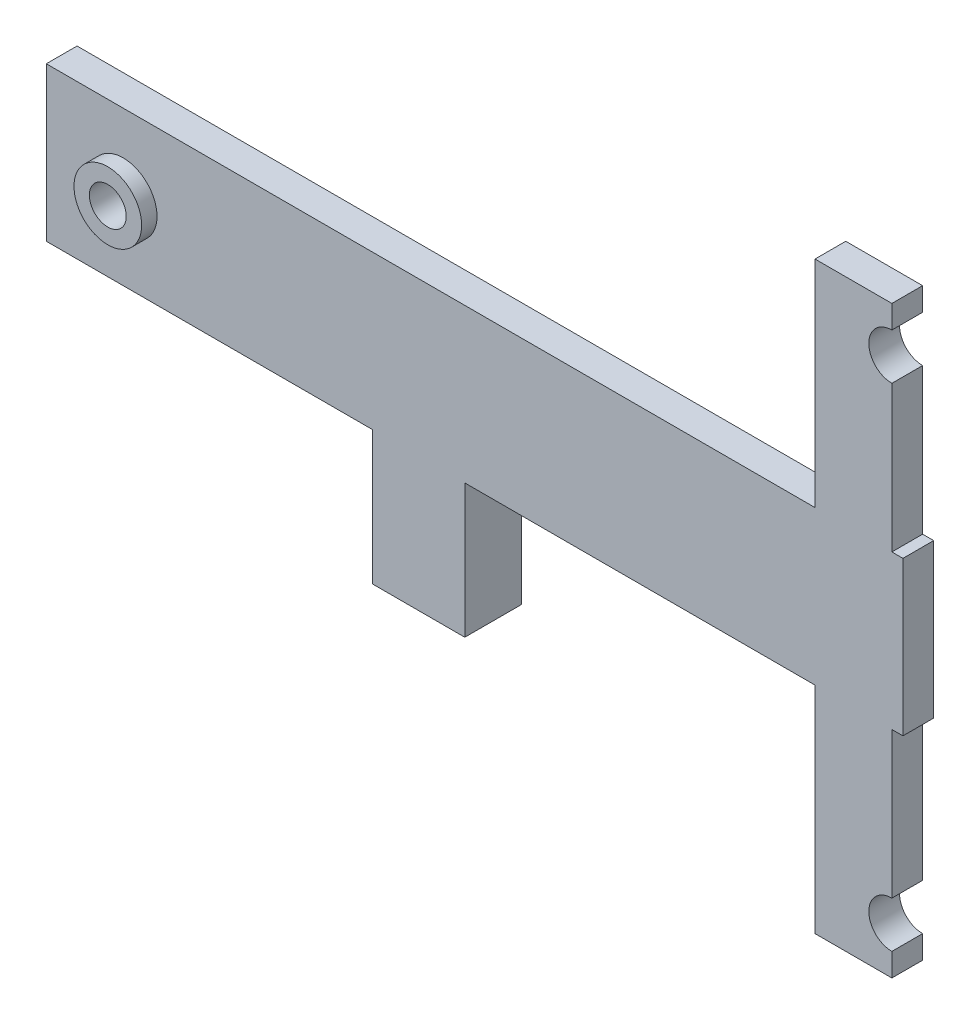
ISO-10303-21;
HEADER;
FILE_DESCRIPTION(('STEP AP214'),'2;1');
FILE_NAME('part.step','',(''),(''),'','','');
FILE_SCHEMA(('AUTOMOTIVE_DESIGN { 1 0 10303 214 1 1 1 1 }'));
ENDSEC;
DATA;
#1=APPLICATION_CONTEXT('core data for automotive mechanical design processes');
#2=APPLICATION_PROTOCOL_DEFINITION('international standard','automotive_design',2000,#1);
#3=PRODUCT_CONTEXT('',#1,'mechanical');
#4=PRODUCT('Part','Part','',(#3));
#5=PRODUCT_RELATED_PRODUCT_CATEGORY('part','',(#4));
#6=PRODUCT_DEFINITION_FORMATION('','',#4);
#7=PRODUCT_DEFINITION_CONTEXT('part definition',#1,'design');
#8=PRODUCT_DEFINITION('design','',#6,#7);
#9=PRODUCT_DEFINITION_SHAPE('','',#8);
#10=(LENGTH_UNIT() NAMED_UNIT(*) SI_UNIT(.MILLI.,.METRE.));
#11=(NAMED_UNIT(*) PLANE_ANGLE_UNIT() SI_UNIT($,.RADIAN.));
#12=(NAMED_UNIT(*) SI_UNIT($,.STERADIAN.) SOLID_ANGLE_UNIT());
#13=UNCERTAINTY_MEASURE_WITH_UNIT(LENGTH_MEASURE(1.E-05),#10,'distance_accuracy_value','');
#14=(GEOMETRIC_REPRESENTATION_CONTEXT(3) GLOBAL_UNCERTAINTY_ASSIGNED_CONTEXT((#13)) GLOBAL_UNIT_ASSIGNED_CONTEXT((#10,
#11,#12)) REPRESENTATION_CONTEXT('',''));
#15=CARTESIAN_POINT('',(0.,0.,0.));
#16=DIRECTION('',(0.,0.,1.));
#17=DIRECTION('',(1.,0.,0.));
#18=AXIS2_PLACEMENT_3D('',#15,#16,#17);
#19=CARTESIAN_POINT('',(0.,0.,-1.));
#20=DIRECTION('',(0.,0.,1.));
#21=DIRECTION('',(1.,0.,0.));
#22=AXIS2_PLACEMENT_3D('',#19,#20,#21);
#23=PLANE('',#22);
#24=CARTESIAN_POINT('',(0.,0.,-1.));
#25=DIRECTION('',(0.,0.,1.));
#26=DIRECTION('',(1.,0.,0.));
#27=AXIS2_PLACEMENT_3D('',#24,#25,#26);
#28=CIRCLE('',#27,2.2);
#29=CARTESIAN_POINT('',(2.2,0.,-1.));
#30=VERTEX_POINT('',#29);
#31=EDGE_CURVE('E357',#30,#30,#28,.F.);
#32=ORIENTED_EDGE('',*,*,#31,.F.);
#33=EDGE_LOOP('',(#32));
#34=FACE_BOUND('',#33,.T.);
#35=DIRECTION('',(0.,1.,0.));
#36=VECTOR('',#35,1.);
#37=CARTESIAN_POINT('',(16.22,0.,-1.));
#38=LINE('',#37,#36);
#39=CARTESIAN_POINT('',(16.22,-5.,-1.));
#40=VERTEX_POINT('',#39);
#41=CARTESIAN_POINT('',(16.22,-1.696,-1.));
#42=VERTEX_POINT('',#41);
#43=EDGE_CURVE('E226',#40,#42,#38,.T.);
#44=ORIENTED_EDGE('',*,*,#43,.F.);
#45=DIRECTION('',(-1.,0.,0.));
#46=VECTOR('',#45,1.);
#47=CARTESIAN_POINT('',(0.,-5.,-1.));
#48=LINE('',#47,#46);
#49=CARTESIAN_POINT('',(-4.99999999999999,-5.,-1.));
#50=VERTEX_POINT('',#49);
#51=EDGE_CURVE('E286',#40,#50,#48,.T.);
#52=ORIENTED_EDGE('',*,*,#51,.T.);
#53=DIRECTION('',(0.,1.,0.));
#54=VECTOR('',#53,1.);
#55=CARTESIAN_POINT('',(-4.99999999999999,0.,-1.));
#56=LINE('',#55,#54);
#57=CARTESIAN_POINT('',(-4.99999999999999,5.,-1.));
#58=VERTEX_POINT('',#57);
#59=EDGE_CURVE('E307',#50,#58,#56,.T.);
#60=ORIENTED_EDGE('',*,*,#59,.T.);
#61=DIRECTION('',(1.,0.,0.));
#62=VECTOR('',#61,1.);
#63=CARTESIAN_POINT('',(0.,5.,-1.));
#64=LINE('',#63,#62);
#65=CARTESIAN_POINT('',(45.,5.00000000000001,-1.));
#66=VERTEX_POINT('',#65);
#67=EDGE_CURVE('E294',#58,#66,#64,.T.);
#68=ORIENTED_EDGE('',*,*,#67,.T.);
#69=DIRECTION('',(0.,1.,0.));
#70=VECTOR('',#69,1.);
#71=CARTESIAN_POINT('',(45.,0.,-1.));
#72=LINE('',#71,#70);
#73=CARTESIAN_POINT('',(45.,19.,-1.));
#74=VERTEX_POINT('',#73);
#75=EDGE_CURVE('E304',#66,#74,#72,.T.);
#76=ORIENTED_EDGE('',*,*,#75,.T.);
#77=DIRECTION('',(1.,0.,0.));
#78=VECTOR('',#77,1.);
#79=CARTESIAN_POINT('',(0.,19.,-1.));
#80=LINE('',#79,#78);
#81=CARTESIAN_POINT('',(50.,19.,-1.));
#82=VERTEX_POINT('',#81);
#83=EDGE_CURVE('E301',#74,#82,#80,.T.);
#84=ORIENTED_EDGE('',*,*,#83,.T.);
#85=DIRECTION('',(0.,-1.,0.));
#86=VECTOR('',#85,1.);
#87=CARTESIAN_POINT('',(50.,0.,-1.));
#88=LINE('',#87,#86);
#89=CARTESIAN_POINT('',(50.,17.5,-1.));
#90=VERTEX_POINT('',#89);
#91=EDGE_CURVE('E298',#82,#90,#88,.T.);
#92=ORIENTED_EDGE('',*,*,#91,.T.);
#93=CARTESIAN_POINT('',(50.,16.,-1.));
#94=DIRECTION('',(0.,0.,1.));
#95=DIRECTION('',(1.,0.,0.));
#96=AXIS2_PLACEMENT_3D('',#93,#94,#95);
#97=CIRCLE('',#96,1.5);
#98=CARTESIAN_POINT('',(50.,14.5,-1.));
#99=VERTEX_POINT('',#98);
#100=EDGE_CURVE('E297',#99,#90,#97,.F.);
#101=ORIENTED_EDGE('',*,*,#100,.F.);
#102=CARTESIAN_POINT('',(50.,5.00000000000001,-1.));
#103=VERTEX_POINT('',#102);
#104=EDGE_CURVE('E293',#99,#103,#88,.T.);
#105=ORIENTED_EDGE('',*,*,#104,.T.);
#106=CARTESIAN_POINT('',(50.72,5.00000000000001,-1.));
#107=VERTEX_POINT('',#106);
#108=EDGE_CURVE('E290',#103,#107,#64,.T.);
#109=ORIENTED_EDGE('',*,*,#108,.T.);
#110=DIRECTION('',(0.,1.,0.));
#111=VECTOR('',#110,1.);
#112=CARTESIAN_POINT('',(50.72,0.,-1.));
#113=LINE('',#112,#111);
#114=CARTESIAN_POINT('',(50.72,-4.99999999999999,-1.));
#115=VERTEX_POINT('',#114);
#116=EDGE_CURVE('E285',#115,#107,#113,.T.);
#117=ORIENTED_EDGE('',*,*,#116,.F.);
#118=CARTESIAN_POINT('',(50.,-4.99999999999999,-1.));
#119=VERTEX_POINT('',#118);
#120=EDGE_CURVE('E243',#115,#119,#48,.T.);
#121=ORIENTED_EDGE('',*,*,#120,.T.);
#122=DIRECTION('',(0.,1.,0.));
#123=VECTOR('',#122,1.);
#124=CARTESIAN_POINT('',(50.,0.,-1.));
#125=LINE('',#124,#123);
#126=CARTESIAN_POINT('',(50.,-14.5,-1.));
#127=VERTEX_POINT('',#126);
#128=EDGE_CURVE('E248',#127,#119,#125,.T.);
#129=ORIENTED_EDGE('',*,*,#128,.F.);
#130=CARTESIAN_POINT('',(50.,-16.,-1.));
#131=DIRECTION('',(0.,0.,1.));
#132=DIRECTION('',(1.,0.,0.));
#133=AXIS2_PLACEMENT_3D('',#130,#131,#132);
#134=CIRCLE('',#133,1.5);
#135=CARTESIAN_POINT('',(50.,-17.5,-1.));
#136=VERTEX_POINT('',#135);
#137=EDGE_CURVE('E319',#127,#136,#134,.T.);
#138=ORIENTED_EDGE('',*,*,#137,.T.);
#139=CARTESIAN_POINT('',(50.,-19.,-1.));
#140=VERTEX_POINT('',#139);
#141=EDGE_CURVE('E316',#140,#136,#125,.T.);
#142=ORIENTED_EDGE('',*,*,#141,.F.);
#143=DIRECTION('',(1.,0.,0.));
#144=VECTOR('',#143,1.);
#145=CARTESIAN_POINT('',(0.,-19.,-1.));
#146=LINE('',#145,#144);
#147=CARTESIAN_POINT('',(45.,-19.,-1.));
#148=VERTEX_POINT('',#147);
#149=EDGE_CURVE('E313',#148,#140,#146,.T.);
#150=ORIENTED_EDGE('',*,*,#149,.F.);
#151=DIRECTION('',(0.,-1.,0.));
#152=VECTOR('',#151,1.);
#153=CARTESIAN_POINT('',(45.,0.,-1.));
#154=LINE('',#153,#152);
#155=CARTESIAN_POINT('',(45.,-4.99999999999999,-1.));
#156=VERTEX_POINT('',#155);
#157=EDGE_CURVE('E310',#156,#148,#154,.T.);
#158=ORIENTED_EDGE('',*,*,#157,.F.);
#159=CARTESIAN_POINT('',(22.22,-5.,-1.));
#160=VERTEX_POINT('',#159);
#161=EDGE_CURVE('E287',#156,#160,#48,.T.);
#162=ORIENTED_EDGE('',*,*,#161,.T.);
#163=DIRECTION('',(0.,1.,0.));
#164=VECTOR('',#163,1.);
#165=CARTESIAN_POINT('',(22.22,0.,-1.));
#166=LINE('',#165,#164);
#167=CARTESIAN_POINT('',(22.22,-1.696,-1.));
#168=VERTEX_POINT('',#167);
#169=EDGE_CURVE('E53',#160,#168,#166,.T.);
#170=ORIENTED_EDGE('',*,*,#169,.T.);
#171=DIRECTION('',(1.,0.,0.));
#172=VECTOR('',#171,1.);
#173=CARTESIAN_POINT('',(0.,-1.696,-1.));
#174=LINE('',#173,#172);
#175=EDGE_CURVE('E11',#42,#168,#174,.T.);
#176=ORIENTED_EDGE('',*,*,#175,.F.);
#177=EDGE_LOOP('',(#44,#52,#60,#68,#76,#84,#92,#101,#105,#109,#117,#121,#129,#138,#142,#150,
#158,#162,#170,#176));
#178=FACE_BOUND('',#177,.T.);
#179=ADVANCED_FACE('F35',(#34,#178),#23,.F.);
#180=CARTESIAN_POINT('',(0.,-5.,1.));
#181=DIRECTION('',(0.,-1.,0.));
#182=DIRECTION('',(1.,0.,0.));
#183=AXIS2_PLACEMENT_3D('',#180,#181,#182);
#184=PLANE('',#183);
#185=ORIENTED_EDGE('',*,*,#51,.F.);
#186=DIRECTION('',(0.,0.,1.));
#187=VECTOR('',#186,1.);
#188=CARTESIAN_POINT('',(16.22,-5.,1.));
#189=LINE('',#188,#187);
#190=CARTESIAN_POINT('',(16.22,-5.,1.));
#191=VERTEX_POINT('',#190);
#192=EDGE_CURVE('E43',#40,#191,#189,.T.);
#193=ORIENTED_EDGE('',*,*,#192,.T.);
#194=DIRECTION('',(-1.,0.,0.));
#195=VECTOR('',#194,1.);
#196=CARTESIAN_POINT('',(0.,-5.,1.));
#197=LINE('',#196,#195);
#198=CARTESIAN_POINT('',(-4.99999999999999,-5.,1.));
#199=VERTEX_POINT('',#198);
#200=EDGE_CURVE('E249',#191,#199,#197,.T.);
#201=ORIENTED_EDGE('',*,*,#200,.T.);
#202=DIRECTION('',(0.,0.,-1.));
#203=VECTOR('',#202,1.);
#204=CARTESIAN_POINT('',(-4.99999999999999,-5.,1.));
#205=LINE('',#204,#203);
#206=EDGE_CURVE('E336',#199,#50,#205,.T.);
#207=ORIENTED_EDGE('',*,*,#206,.T.);
#208=EDGE_LOOP('',(#185,#193,#201,#207));
#209=FACE_BOUND('',#208,.T.);
#210=ADVANCED_FACE('F366',(#209),#184,.T.);
#211=CARTESIAN_POINT('',(0.,0.,1.));
#212=DIRECTION('',(0.,0.,1.));
#213=DIRECTION('',(1.,0.,0.));
#214=AXIS2_PLACEMENT_3D('',#211,#212,#213);
#215=PLANE('',#214);
#216=ORIENTED_EDGE('',*,*,#200,.F.);
#217=DIRECTION('',(0.,1.,0.));
#218=VECTOR('',#217,1.);
#219=CARTESIAN_POINT('',(16.22,-13.696,1.));
#220=LINE('',#219,#218);
#221=CARTESIAN_POINT('',(16.22,-13.696,1.));
#222=VERTEX_POINT('',#221);
#223=EDGE_CURVE('E189',#222,#191,#220,.T.);
#224=ORIENTED_EDGE('',*,*,#223,.F.);
#225=DIRECTION('',(-1.,0.,0.));
#226=VECTOR('',#225,1.);
#227=CARTESIAN_POINT('',(22.22,-13.696,1.));
#228=LINE('',#227,#226);
#229=CARTESIAN_POINT('',(22.22,-13.696,1.));
#230=VERTEX_POINT('',#229);
#231=EDGE_CURVE('E215',#230,#222,#228,.T.);
#232=ORIENTED_EDGE('',*,*,#231,.F.);
#233=DIRECTION('',(0.,-1.,0.));
#234=VECTOR('',#233,1.);
#235=CARTESIAN_POINT('',(22.22,-1.696,1.));
#236=LINE('',#235,#234);
#237=CARTESIAN_POINT('',(22.22,-5.,1.));
#238=VERTEX_POINT('',#237);
#239=EDGE_CURVE('E213',#238,#230,#236,.T.);
#240=ORIENTED_EDGE('',*,*,#239,.F.);
#241=CARTESIAN_POINT('',(45.,-4.99999999999999,1.));
#242=VERTEX_POINT('',#241);
#243=EDGE_CURVE('E250',#242,#238,#197,.T.);
#244=ORIENTED_EDGE('',*,*,#243,.F.);
#245=DIRECTION('',(0.,-1.,0.));
#246=VECTOR('',#245,1.);
#247=CARTESIAN_POINT('',(45.,0.,1.));
#248=LINE('',#247,#246);
#249=CARTESIAN_POINT('',(45.,-19.,1.));
#250=VERTEX_POINT('',#249);
#251=EDGE_CURVE('E271',#242,#250,#248,.T.);
#252=ORIENTED_EDGE('',*,*,#251,.T.);
#253=DIRECTION('',(1.,0.,0.));
#254=VECTOR('',#253,1.);
#255=CARTESIAN_POINT('',(0.,-19.,1.));
#256=LINE('',#255,#254);
#257=CARTESIAN_POINT('',(50.,-19.,1.));
#258=VERTEX_POINT('',#257);
#259=EDGE_CURVE('E274',#250,#258,#256,.T.);
#260=ORIENTED_EDGE('',*,*,#259,.T.);
#261=DIRECTION('',(0.,1.,0.));
#262=VECTOR('',#261,1.);
#263=CARTESIAN_POINT('',(50.,0.,1.));
#264=LINE('',#263,#262);
#265=CARTESIAN_POINT('',(50.,-17.5,1.));
#266=VERTEX_POINT('',#265);
#267=EDGE_CURVE('E277',#258,#266,#264,.T.);
#268=ORIENTED_EDGE('',*,*,#267,.T.);
#269=CARTESIAN_POINT('',(50.,-16.,1.));
#270=DIRECTION('',(0.,0.,1.));
#271=DIRECTION('',(1.,0.,0.));
#272=AXIS2_PLACEMENT_3D('',#269,#270,#271);
#273=CIRCLE('',#272,1.5);
#274=CARTESIAN_POINT('',(50.,-14.5,1.));
#275=VERTEX_POINT('',#274);
#276=EDGE_CURVE('E279',#275,#266,#273,.T.);
#277=ORIENTED_EDGE('',*,*,#276,.F.);
#278=CARTESIAN_POINT('',(50.,-4.99999999999999,1.));
#279=VERTEX_POINT('',#278);
#280=EDGE_CURVE('E280',#275,#279,#264,.T.);
#281=ORIENTED_EDGE('',*,*,#280,.T.);
#282=CARTESIAN_POINT('',(50.72,-4.99999999999999,1.));
#283=VERTEX_POINT('',#282);
#284=EDGE_CURVE('E244',#283,#279,#197,.T.);
#285=ORIENTED_EDGE('',*,*,#284,.F.);
#286=DIRECTION('',(0.,1.,0.));
#287=VECTOR('',#286,1.);
#288=CARTESIAN_POINT('',(50.72,0.,1.));
#289=LINE('',#288,#287);
#290=CARTESIAN_POINT('',(50.72,5.00000000000001,1.));
#291=VERTEX_POINT('',#290);
#292=EDGE_CURVE('E247',#283,#291,#289,.T.);
#293=ORIENTED_EDGE('',*,*,#292,.T.);
#294=DIRECTION('',(1.,0.,0.));
#295=VECTOR('',#294,1.);
#296=CARTESIAN_POINT('',(0.,5.,1.));
#297=LINE('',#296,#295);
#298=CARTESIAN_POINT('',(50.,5.00000000000001,1.));
#299=VERTEX_POINT('',#298);
#300=EDGE_CURVE('E252',#299,#291,#297,.T.);
#301=ORIENTED_EDGE('',*,*,#300,.F.);
#302=DIRECTION('',(0.,-1.,0.));
#303=VECTOR('',#302,1.);
#304=CARTESIAN_POINT('',(50.,0.,1.));
#305=LINE('',#304,#303);
#306=CARTESIAN_POINT('',(50.,14.5,1.));
#307=VERTEX_POINT('',#306);
#308=EDGE_CURVE('E255',#307,#299,#305,.T.);
#309=ORIENTED_EDGE('',*,*,#308,.F.);
#310=CARTESIAN_POINT('',(50.,16.,1.));
#311=DIRECTION('',(0.,0.,1.));
#312=DIRECTION('',(1.,0.,0.));
#313=AXIS2_PLACEMENT_3D('',#310,#311,#312);
#314=CIRCLE('',#313,1.5);
#315=CARTESIAN_POINT('',(50.,17.5,1.));
#316=VERTEX_POINT('',#315);
#317=EDGE_CURVE('E259',#307,#316,#314,.F.);
#318=ORIENTED_EDGE('',*,*,#317,.T.);
#319=CARTESIAN_POINT('',(50.,19.,1.));
#320=VERTEX_POINT('',#319);
#321=EDGE_CURVE('E260',#320,#316,#305,.T.);
#322=ORIENTED_EDGE('',*,*,#321,.F.);
#323=DIRECTION('',(1.,0.,0.));
#324=VECTOR('',#323,1.);
#325=CARTESIAN_POINT('',(0.,19.,1.));
#326=LINE('',#325,#324);
#327=CARTESIAN_POINT('',(45.,19.,1.));
#328=VERTEX_POINT('',#327);
#329=EDGE_CURVE('E262',#328,#320,#326,.T.);
#330=ORIENTED_EDGE('',*,*,#329,.F.);
#331=DIRECTION('',(0.,1.,0.));
#332=VECTOR('',#331,1.);
#333=CARTESIAN_POINT('',(45.,0.,1.));
#334=LINE('',#333,#332);
#335=CARTESIAN_POINT('',(45.,5.00000000000001,1.));
#336=VERTEX_POINT('',#335);
#337=EDGE_CURVE('E265',#336,#328,#334,.T.);
#338=ORIENTED_EDGE('',*,*,#337,.F.);
#339=CARTESIAN_POINT('',(-4.99999999999999,5.,1.));
#340=VERTEX_POINT('',#339);
#341=EDGE_CURVE('E256',#340,#336,#297,.T.);
#342=ORIENTED_EDGE('',*,*,#341,.F.);
#343=DIRECTION('',(0.,1.,0.));
#344=VECTOR('',#343,1.);
#345=CARTESIAN_POINT('',(-4.99999999999999,0.,1.));
#346=LINE('',#345,#344);
#347=EDGE_CURVE('E268',#199,#340,#346,.T.);
#348=ORIENTED_EDGE('',*,*,#347,.F.);
#349=EDGE_LOOP('',(#216,#224,#232,#240,#244,#252,#260,#268,#277,#281,#285,#293,#301,#309,#318,
#322,#330,#338,#342,#348));
#350=FACE_BOUND('',#349,.T.);
#351=CARTESIAN_POINT('',(0.,0.,1.));
#352=DIRECTION('',(0.,0.,1.));
#353=DIRECTION('',(1.,0.,0.));
#354=AXIS2_PLACEMENT_3D('',#351,#352,#353);
#355=CIRCLE('',#354,2.2);
#356=CARTESIAN_POINT('',(2.2,0.,1.));
#357=VERTEX_POINT('',#356);
#358=EDGE_CURVE('E238',#357,#357,#355,.F.);
#359=ORIENTED_EDGE('',*,*,#358,.T.);
#360=EDGE_LOOP('',(#359));
#361=FACE_BOUND('',#360,.T.);
#362=ADVANCED_FACE('F373',(#350,#361),#215,.T.);
#363=ORIENTED_EDGE('',*,*,#120,.F.);
#364=DIRECTION('',(0.,0.,-1.));
#365=VECTOR('',#364,1.);
#366=CARTESIAN_POINT('',(50.72,-4.99999999999999,1.));
#367=LINE('',#366,#365);
#368=EDGE_CURVE('E355',#283,#115,#367,.T.);
#369=ORIENTED_EDGE('',*,*,#368,.F.);
#370=ORIENTED_EDGE('',*,*,#284,.T.);
#371=DIRECTION('',(0.,0.,-1.));
#372=VECTOR('',#371,1.);
#373=CARTESIAN_POINT('',(50.,-4.99999999999999,1.));
#374=LINE('',#373,#372);
#375=EDGE_CURVE('E322',#279,#119,#374,.T.);
#376=ORIENTED_EDGE('',*,*,#375,.T.);
#377=EDGE_LOOP('',(#363,#369,#370,#376));
#378=FACE_BOUND('',#377,.T.);
#379=ADVANCED_FACE('F420',(#378),#184,.T.);
#380=CARTESIAN_POINT('',(50.72,0.,1.));
#381=DIRECTION('',(-1.,0.,0.));
#382=DIRECTION('',(0.,0.,1.));
#383=AXIS2_PLACEMENT_3D('',#380,#381,#382);
#384=PLANE('',#383);
#385=ORIENTED_EDGE('',*,*,#116,.T.);
#386=DIRECTION('',(0.,0.,-1.));
#387=VECTOR('',#386,1.);
#388=CARTESIAN_POINT('',(50.72,5.00000000000001,1.));
#389=LINE('',#388,#387);
#390=EDGE_CURVE('E353',#291,#107,#389,.T.);
#391=ORIENTED_EDGE('',*,*,#390,.F.);
#392=ORIENTED_EDGE('',*,*,#292,.F.);
#393=ORIENTED_EDGE('',*,*,#368,.T.);
#394=EDGE_LOOP('',(#385,#391,#392,#393));
#395=FACE_BOUND('',#394,.T.);
#396=ADVANCED_FACE('F37',(#395),#384,.F.);
#397=CARTESIAN_POINT('',(0.,5.,1.));
#398=DIRECTION('',(0.,1.,0.));
#399=DIRECTION('',(-1.,0.,0.));
#400=AXIS2_PLACEMENT_3D('',#397,#398,#399);
#401=PLANE('',#400);
#402=ORIENTED_EDGE('',*,*,#108,.F.);
#403=DIRECTION('',(0.,0.,-1.));
#404=VECTOR('',#403,1.);
#405=CARTESIAN_POINT('',(50.,5.00000000000001,1.));
#406=LINE('',#405,#404);
#407=EDGE_CURVE('E351',#299,#103,#406,.T.);
#408=ORIENTED_EDGE('',*,*,#407,.F.);
#409=ORIENTED_EDGE('',*,*,#300,.T.);
#410=ORIENTED_EDGE('',*,*,#390,.T.);
#411=EDGE_LOOP('',(#402,#408,#409,#410));
#412=FACE_BOUND('',#411,.T.);
#413=ADVANCED_FACE('F413',(#412),#401,.T.);
#414=CARTESIAN_POINT('',(50.,0.,1.));
#415=DIRECTION('',(1.,0.,0.));
#416=DIRECTION('',(0.,0.,-1.));
#417=AXIS2_PLACEMENT_3D('',#414,#415,#416);
#418=PLANE('',#417);
#419=ORIENTED_EDGE('',*,*,#104,.F.);
#420=DIRECTION('',(0.,0.,-1.));
#421=VECTOR('',#420,1.);
#422=CARTESIAN_POINT('',(50.,14.5,1.));
#423=LINE('',#422,#421);
#424=EDGE_CURVE('E349',#307,#99,#423,.T.);
#425=ORIENTED_EDGE('',*,*,#424,.F.);
#426=ORIENTED_EDGE('',*,*,#308,.T.);
#427=ORIENTED_EDGE('',*,*,#407,.T.);
#428=EDGE_LOOP('',(#419,#425,#426,#427));
#429=FACE_BOUND('',#428,.T.);
#430=ADVANCED_FACE('F407',(#429),#418,.T.);
#431=CARTESIAN_POINT('',(50.,16.,1.));
#432=DIRECTION('',(0.,0.,-1.));
#433=DIRECTION('',(-1.,0.,0.));
#434=AXIS2_PLACEMENT_3D('',#431,#432,#433);
#435=CYLINDRICAL_SURFACE('',#434,1.5);
#436=ORIENTED_EDGE('',*,*,#100,.T.);
#437=DIRECTION('',(0.,0.,-1.));
#438=VECTOR('',#437,1.);
#439=CARTESIAN_POINT('',(50.,17.5,1.));
#440=LINE('',#439,#438);
#441=EDGE_CURVE('E347',#316,#90,#440,.T.);
#442=ORIENTED_EDGE('',*,*,#441,.F.);
#443=ORIENTED_EDGE('',*,*,#317,.F.);
#444=ORIENTED_EDGE('',*,*,#424,.T.);
#445=EDGE_LOOP('',(#436,#442,#443,#444));
#446=FACE_BOUND('',#445,.T.);
#447=ADVANCED_FACE('F488',(#446),#435,.F.);
#448=ORIENTED_EDGE('',*,*,#91,.F.);
#449=DIRECTION('',(0.,0.,-1.));
#450=VECTOR('',#449,1.);
#451=CARTESIAN_POINT('',(50.,19.,1.));
#452=LINE('',#451,#450);
#453=EDGE_CURVE('E345',#320,#82,#452,.T.);
#454=ORIENTED_EDGE('',*,*,#453,.F.);
#455=ORIENTED_EDGE('',*,*,#321,.T.);
#456=ORIENTED_EDGE('',*,*,#441,.T.);
#457=EDGE_LOOP('',(#448,#454,#455,#456));
#458=FACE_BOUND('',#457,.T.);
#459=ADVANCED_FACE('F401',(#458),#418,.T.);
#460=CARTESIAN_POINT('',(0.,19.,1.));
#461=DIRECTION('',(0.,1.,0.));
#462=DIRECTION('',(-1.,0.,0.));
#463=AXIS2_PLACEMENT_3D('',#460,#461,#462);
#464=PLANE('',#463);
#465=ORIENTED_EDGE('',*,*,#83,.F.);
#466=DIRECTION('',(0.,0.,-1.));
#467=VECTOR('',#466,1.);
#468=CARTESIAN_POINT('',(45.,19.,1.));
#469=LINE('',#468,#467);
#470=EDGE_CURVE('E343',#328,#74,#469,.T.);
#471=ORIENTED_EDGE('',*,*,#470,.F.);
#472=ORIENTED_EDGE('',*,*,#329,.T.);
#473=ORIENTED_EDGE('',*,*,#453,.T.);
#474=EDGE_LOOP('',(#465,#471,#472,#473));
#475=FACE_BOUND('',#474,.T.);
#476=ADVANCED_FACE('F396',(#475),#464,.T.);
#477=CARTESIAN_POINT('',(45.,0.,1.));
#478=DIRECTION('',(-1.,0.,0.));
#479=DIRECTION('',(0.,0.,1.));
#480=AXIS2_PLACEMENT_3D('',#477,#478,#479);
#481=PLANE('',#480);
#482=ORIENTED_EDGE('',*,*,#75,.F.);
#483=DIRECTION('',(0.,0.,-1.));
#484=VECTOR('',#483,1.);
#485=CARTESIAN_POINT('',(45.,5.00000000000001,1.));
#486=LINE('',#485,#484);
#487=EDGE_CURVE('E341',#336,#66,#486,.T.);
#488=ORIENTED_EDGE('',*,*,#487,.F.);
#489=ORIENTED_EDGE('',*,*,#337,.T.);
#490=ORIENTED_EDGE('',*,*,#470,.T.);
#491=EDGE_LOOP('',(#482,#488,#489,#490));
#492=FACE_BOUND('',#491,.T.);
#493=ADVANCED_FACE('F392',(#492),#481,.T.);
#494=ORIENTED_EDGE('',*,*,#67,.F.);
#495=DIRECTION('',(0.,0.,-1.));
#496=VECTOR('',#495,1.);
#497=CARTESIAN_POINT('',(-4.99999999999999,5.,1.));
#498=LINE('',#497,#496);
#499=EDGE_CURVE('E339',#340,#58,#498,.T.);
#500=ORIENTED_EDGE('',*,*,#499,.F.);
#501=ORIENTED_EDGE('',*,*,#341,.T.);
#502=ORIENTED_EDGE('',*,*,#487,.T.);
#503=EDGE_LOOP('',(#494,#500,#501,#502));
#504=FACE_BOUND('',#503,.T.);
#505=ADVANCED_FACE('F387',(#504),#401,.T.);
#506=CARTESIAN_POINT('',(-4.99999999999999,0.,1.));
#507=DIRECTION('',(-1.,0.,0.));
#508=DIRECTION('',(0.,-1.,0.));
#509=AXIS2_PLACEMENT_3D('',#506,#507,#508);
#510=PLANE('',#509);
#511=ORIENTED_EDGE('',*,*,#59,.F.);
#512=ORIENTED_EDGE('',*,*,#206,.F.);
#513=ORIENTED_EDGE('',*,*,#347,.T.);
#514=ORIENTED_EDGE('',*,*,#499,.T.);
#515=EDGE_LOOP('',(#511,#512,#513,#514));
#516=FACE_BOUND('',#515,.T.);
#517=ADVANCED_FACE('F382',(#516),#510,.T.);
#518=DIRECTION('',(0.,0.,1.));
#519=VECTOR('',#518,1.);
#520=CARTESIAN_POINT('',(22.22,-5.,1.));
#521=LINE('',#520,#519);
#522=EDGE_CURVE('E360',#160,#238,#521,.T.);
#523=ORIENTED_EDGE('',*,*,#522,.F.);
#524=ORIENTED_EDGE('',*,*,#161,.F.);
#525=DIRECTION('',(0.,0.,-1.));
#526=VECTOR('',#525,1.);
#527=CARTESIAN_POINT('',(45.,-4.99999999999999,1.));
#528=LINE('',#527,#526);
#529=EDGE_CURVE('E334',#242,#156,#528,.T.);
#530=ORIENTED_EDGE('',*,*,#529,.F.);
#531=ORIENTED_EDGE('',*,*,#243,.T.);
#532=EDGE_LOOP('',(#523,#524,#530,#531));
#533=FACE_BOUND('',#532,.T.);
#534=ADVANCED_FACE('F446',(#533),#184,.T.);
#535=CARTESIAN_POINT('',(45.,0.,1.));
#536=DIRECTION('',(1.,0.,0.));
#537=DIRECTION('',(0.,0.,-1.));
#538=AXIS2_PLACEMENT_3D('',#535,#536,#537);
#539=PLANE('',#538);
#540=ORIENTED_EDGE('',*,*,#157,.T.);
#541=DIRECTION('',(0.,0.,-1.));
#542=VECTOR('',#541,1.);
#543=CARTESIAN_POINT('',(45.,-19.,1.));
#544=LINE('',#543,#542);
#545=EDGE_CURVE('E331',#250,#148,#544,.T.);
#546=ORIENTED_EDGE('',*,*,#545,.F.);
#547=ORIENTED_EDGE('',*,*,#251,.F.);
#548=ORIENTED_EDGE('',*,*,#529,.T.);
#549=EDGE_LOOP('',(#540,#546,#547,#548));
#550=FACE_BOUND('',#549,.T.);
#551=ADVANCED_FACE('F443',(#550),#539,.F.);
#552=CARTESIAN_POINT('',(0.,-19.,1.));
#553=DIRECTION('',(0.,1.,0.));
#554=DIRECTION('',(-1.,0.,0.));
#555=AXIS2_PLACEMENT_3D('',#552,#553,#554);
#556=PLANE('',#555);
#557=ORIENTED_EDGE('',*,*,#149,.T.);
#558=DIRECTION('',(0.,0.,-1.));
#559=VECTOR('',#558,1.);
#560=CARTESIAN_POINT('',(50.,-19.,1.));
#561=LINE('',#560,#559);
#562=EDGE_CURVE('E328',#258,#140,#561,.T.);
#563=ORIENTED_EDGE('',*,*,#562,.F.);
#564=ORIENTED_EDGE('',*,*,#259,.F.);
#565=ORIENTED_EDGE('',*,*,#545,.T.);
#566=EDGE_LOOP('',(#557,#563,#564,#565));
#567=FACE_BOUND('',#566,.T.);
#568=ADVANCED_FACE('F440',(#567),#556,.F.);
#569=CARTESIAN_POINT('',(50.,0.,1.));
#570=DIRECTION('',(-1.,0.,0.));
#571=DIRECTION('',(0.,0.,1.));
#572=AXIS2_PLACEMENT_3D('',#569,#570,#571);
#573=PLANE('',#572);
#574=ORIENTED_EDGE('',*,*,#141,.T.);
#575=DIRECTION('',(0.,0.,-1.));
#576=VECTOR('',#575,1.);
#577=CARTESIAN_POINT('',(50.,-17.5,1.));
#578=LINE('',#577,#576);
#579=EDGE_CURVE('E326',#266,#136,#578,.T.);
#580=ORIENTED_EDGE('',*,*,#579,.F.);
#581=ORIENTED_EDGE('',*,*,#267,.F.);
#582=ORIENTED_EDGE('',*,*,#562,.T.);
#583=EDGE_LOOP('',(#574,#580,#581,#582));
#584=FACE_BOUND('',#583,.T.);
#585=ADVANCED_FACE('F434',(#584),#573,.F.);
#586=CARTESIAN_POINT('',(50.,-16.,1.));
#587=DIRECTION('',(0.,0.,-1.));
#588=DIRECTION('',(-1.,0.,0.));
#589=AXIS2_PLACEMENT_3D('',#586,#587,#588);
#590=CYLINDRICAL_SURFACE('',#589,1.5);
#591=ORIENTED_EDGE('',*,*,#137,.F.);
#592=DIRECTION('',(0.,0.,-1.));
#593=VECTOR('',#592,1.);
#594=CARTESIAN_POINT('',(50.,-14.5,1.));
#595=LINE('',#594,#593);
#596=EDGE_CURVE('E324',#275,#127,#595,.T.);
#597=ORIENTED_EDGE('',*,*,#596,.F.);
#598=ORIENTED_EDGE('',*,*,#276,.T.);
#599=ORIENTED_EDGE('',*,*,#579,.T.);
#600=EDGE_LOOP('',(#591,#597,#598,#599));
#601=FACE_BOUND('',#600,.T.);
#602=ADVANCED_FACE('F430',(#601),#590,.F.);
#603=ORIENTED_EDGE('',*,*,#128,.T.);
#604=ORIENTED_EDGE('',*,*,#375,.F.);
#605=ORIENTED_EDGE('',*,*,#280,.F.);
#606=ORIENTED_EDGE('',*,*,#596,.T.);
#607=EDGE_LOOP('',(#603,#604,#605,#606));
#608=FACE_BOUND('',#607,.T.);
#609=ADVANCED_FACE('F427',(#608),#573,.F.);
#610=CARTESIAN_POINT('',(0.,0.,2.));
#611=DIRECTION('',(0.,0.,-1.));
#612=DIRECTION('',(-1.,0.,0.));
#613=AXIS2_PLACEMENT_3D('',#610,#611,#612);
#614=CYLINDRICAL_SURFACE('',#613,2.2);
#615=CARTESIAN_POINT('',(0.,0.,-2.));
#616=DIRECTION('',(0.,0.,1.));
#617=DIRECTION('',(1.,0.,0.));
#618=AXIS2_PLACEMENT_3D('',#615,#616,#617);
#619=CIRCLE('',#618,2.2);
#620=CARTESIAN_POINT('',(2.2,0.,-2.));
#621=VERTEX_POINT('',#620);
#622=EDGE_CURVE('E232',#621,#621,#619,.T.);
#623=ORIENTED_EDGE('',*,*,#622,.T.);
#624=EDGE_LOOP('',(#623));
#625=FACE_BOUND('',#624,.T.);
#626=ORIENTED_EDGE('',*,*,#31,.T.);
#627=EDGE_LOOP('',(#626));
#628=FACE_BOUND('',#627,.T.);
#629=ADVANCED_FACE('F472',(#625,#628),#614,.T.);
#630=CARTESIAN_POINT('',(0.,0.,-2.));
#631=DIRECTION('',(0.,0.,1.));
#632=DIRECTION('',(1.,0.,0.));
#633=AXIS2_PLACEMENT_3D('',#630,#631,#632);
#634=PLANE('',#633);
#635=ORIENTED_EDGE('',*,*,#622,.F.);
#636=EDGE_LOOP('',(#635));
#637=FACE_BOUND('',#636,.T.);
#638=CARTESIAN_POINT('',(0.,0.,-2.));
#639=DIRECTION('',(0.,0.,1.));
#640=DIRECTION('',(1.,0.,0.));
#641=AXIS2_PLACEMENT_3D('',#638,#639,#640);
#642=CIRCLE('',#641,1.2);
#643=CARTESIAN_POINT('',(1.2,0.,-2.));
#644=VERTEX_POINT('',#643);
#645=EDGE_CURVE('E228',#644,#644,#642,.T.);
#646=ORIENTED_EDGE('',*,*,#645,.T.);
#647=EDGE_LOOP('',(#646));
#648=FACE_BOUND('',#647,.T.);
#649=ADVANCED_FACE('F468',(#637,#648),#634,.F.);
#650=CARTESIAN_POINT('',(0.,0.,1.));
#651=DIRECTION('',(0.,0.,-1.));
#652=DIRECTION('',(-1.,0.,0.));
#653=AXIS2_PLACEMENT_3D('',#650,#651,#652);
#654=CYLINDRICAL_SURFACE('',#653,1.2);
#655=ORIENTED_EDGE('',*,*,#645,.F.);
#656=EDGE_LOOP('',(#655));
#657=FACE_BOUND('',#656,.T.);
#658=CARTESIAN_POINT('',(0.,0.,2.));
#659=DIRECTION('',(0.,0.,1.));
#660=DIRECTION('',(1.,0.,0.));
#661=AXIS2_PLACEMENT_3D('',#658,#659,#660);
#662=CIRCLE('',#661,1.2);
#663=CARTESIAN_POINT('',(1.2,0.,2.));
#664=VERTEX_POINT('',#663);
#665=EDGE_CURVE('E229',#664,#664,#662,.T.);
#666=ORIENTED_EDGE('',*,*,#665,.T.);
#667=EDGE_LOOP('',(#666));
#668=FACE_BOUND('',#667,.T.);
#669=ADVANCED_FACE('F464',(#657,#668),#654,.F.);
#670=CARTESIAN_POINT('',(0.,0.,2.));
#671=DIRECTION('',(0.,0.,1.));
#672=DIRECTION('',(1.,0.,0.));
#673=AXIS2_PLACEMENT_3D('',#670,#671,#672);
#674=PLANE('',#673);
#675=CARTESIAN_POINT('',(0.,0.,2.));
#676=DIRECTION('',(0.,0.,1.));
#677=DIRECTION('',(1.,0.,0.));
#678=AXIS2_PLACEMENT_3D('',#675,#676,#677);
#679=CIRCLE('',#678,2.2);
#680=CARTESIAN_POINT('',(2.2,0.,2.));
#681=VERTEX_POINT('',#680);
#682=EDGE_CURVE('E235',#681,#681,#679,.T.);
#683=ORIENTED_EDGE('',*,*,#682,.T.);
#684=EDGE_LOOP('',(#683));
#685=FACE_BOUND('',#684,.T.);
#686=ORIENTED_EDGE('',*,*,#665,.F.);
#687=EDGE_LOOP('',(#686));
#688=FACE_BOUND('',#687,.T.);
#689=ADVANCED_FACE('F467',(#685,#688),#674,.T.);
#690=ORIENTED_EDGE('',*,*,#358,.F.);
#691=EDGE_LOOP('',(#690));
#692=FACE_BOUND('',#691,.T.);
#693=ORIENTED_EDGE('',*,*,#682,.F.);
#694=EDGE_LOOP('',(#693));
#695=FACE_BOUND('',#694,.T.);
#696=ADVANCED_FACE('F536',(#692,#695),#614,.T.);
#697=CARTESIAN_POINT('',(19.22,-1.696,1.));
#698=DIRECTION('',(0.,-1.,0.));
#699=DIRECTION('',(0.,0.,-1.));
#700=AXIS2_PLACEMENT_3D('',#697,#698,#699);
#701=PLANE('',#700);
#702=DIRECTION('',(0.,0.,-1.));
#703=VECTOR('',#702,1.);
#704=CARTESIAN_POINT('',(16.22,-1.696,1.));
#705=LINE('',#704,#703);
#706=CARTESIAN_POINT('',(16.22,-1.696,-2.7018));
#707=VERTEX_POINT('',#706);
#708=EDGE_CURVE('E220',#42,#707,#705,.T.);
#709=ORIENTED_EDGE('',*,*,#708,.F.);
#710=ORIENTED_EDGE('',*,*,#175,.T.);
#711=DIRECTION('',(0.,0.,-1.));
#712=VECTOR('',#711,1.);
#713=CARTESIAN_POINT('',(22.22,-1.696,1.));
#714=LINE('',#713,#712);
#715=CARTESIAN_POINT('',(22.22,-1.696,-2.7018));
#716=VERTEX_POINT('',#715);
#717=EDGE_CURVE('E181',#168,#716,#714,.T.);
#718=ORIENTED_EDGE('',*,*,#717,.T.);
#719=DIRECTION('',(1.,0.,0.));
#720=VECTOR('',#719,1.);
#721=CARTESIAN_POINT('',(19.22,-1.696,-2.7018));
#722=LINE('',#721,#720);
#723=EDGE_CURVE('E186',#707,#716,#722,.T.);
#724=ORIENTED_EDGE('',*,*,#723,.F.);
#725=EDGE_LOOP('',(#709,#710,#718,#724));
#726=FACE_BOUND('',#725,.T.);
#727=ADVANCED_FACE('F184',(#726),#701,.F.);
#728=CARTESIAN_POINT('',(16.22,-1.696,1.));
#729=DIRECTION('',(1.,0.,0.));
#730=DIRECTION('',(0.,0.,-1.));
#731=AXIS2_PLACEMENT_3D('',#728,#729,#730);
#732=PLANE('',#731);
#733=ORIENTED_EDGE('',*,*,#192,.F.);
#734=ORIENTED_EDGE('',*,*,#43,.T.);
#735=ORIENTED_EDGE('',*,*,#708,.T.);
#736=DIRECTION('',(0.,1.,0.));
#737=VECTOR('',#736,1.);
#738=CARTESIAN_POINT('',(16.22,-13.696,-2.7018));
#739=LINE('',#738,#737);
#740=CARTESIAN_POINT('',(16.22,-13.696,-2.7018));
#741=VERTEX_POINT('',#740);
#742=EDGE_CURVE('E203',#741,#707,#739,.T.);
#743=ORIENTED_EDGE('',*,*,#742,.F.);
#744=DIRECTION('',(0.,0.,-1.));
#745=VECTOR('',#744,1.);
#746=CARTESIAN_POINT('',(16.22,-13.696,1.));
#747=LINE('',#746,#745);
#748=EDGE_CURVE('E222',#222,#741,#747,.T.);
#749=ORIENTED_EDGE('',*,*,#748,.F.);
#750=ORIENTED_EDGE('',*,*,#223,.T.);
#751=EDGE_LOOP('',(#733,#734,#735,#743,#749,#750));
#752=FACE_BOUND('',#751,.T.);
#753=ADVANCED_FACE('F370',(#752),#732,.F.);
#754=CARTESIAN_POINT('',(22.22,-1.696,1.));
#755=DIRECTION('',(1.,0.,0.));
#756=DIRECTION('',(0.,0.,-1.));
#757=AXIS2_PLACEMENT_3D('',#754,#755,#756);
#758=PLANE('',#757);
#759=ORIENTED_EDGE('',*,*,#169,.F.);
#760=ORIENTED_EDGE('',*,*,#522,.T.);
#761=ORIENTED_EDGE('',*,*,#239,.T.);
#762=DIRECTION('',(0.,0.,-1.));
#763=VECTOR('',#762,1.);
#764=CARTESIAN_POINT('',(22.22,-13.696,1.));
#765=LINE('',#764,#763);
#766=CARTESIAN_POINT('',(22.22,-13.696,-2.7018));
#767=VERTEX_POINT('',#766);
#768=EDGE_CURVE('E188',#230,#767,#765,.T.);
#769=ORIENTED_EDGE('',*,*,#768,.T.);
#770=DIRECTION('',(0.,-1.,0.));
#771=VECTOR('',#770,1.);
#772=CARTESIAN_POINT('',(22.22,-1.696,-2.7018));
#773=LINE('',#772,#771);
#774=EDGE_CURVE('E192',#716,#767,#773,.T.);
#775=ORIENTED_EDGE('',*,*,#774,.F.);
#776=ORIENTED_EDGE('',*,*,#717,.F.);
#777=EDGE_LOOP('',(#759,#760,#761,#769,#775,#776));
#778=FACE_BOUND('',#777,.T.);
#779=ADVANCED_FACE('F193',(#778),#758,.T.);
#780=CARTESIAN_POINT('',(22.22,-13.696,1.));
#781=DIRECTION('',(0.,-1.,0.));
#782=DIRECTION('',(0.,0.,-1.));
#783=AXIS2_PLACEMENT_3D('',#780,#781,#782);
#784=PLANE('',#783);
#785=ORIENTED_EDGE('',*,*,#748,.T.);
#786=DIRECTION('',(-1.,0.,0.));
#787=VECTOR('',#786,1.);
#788=CARTESIAN_POINT('',(22.22,-13.696,-2.7018));
#789=LINE('',#788,#787);
#790=EDGE_CURVE('E198',#767,#741,#789,.T.);
#791=ORIENTED_EDGE('',*,*,#790,.F.);
#792=ORIENTED_EDGE('',*,*,#768,.F.);
#793=ORIENTED_EDGE('',*,*,#231,.T.);
#794=EDGE_LOOP('',(#785,#791,#792,#793));
#795=FACE_BOUND('',#794,.T.);
#796=ADVANCED_FACE('F378',(#795),#784,.T.);
#797=CARTESIAN_POINT('',(0.,0.,-2.7018));
#798=DIRECTION('',(0.,0.,-1.));
#799=DIRECTION('',(-1.,0.,0.));
#800=AXIS2_PLACEMENT_3D('',#797,#798,#799);
#801=PLANE('',#800);
#802=CARTESIAN_POINT('',(19.22,-4.696,-2.7018));
#803=DIRECTION('',(0.,0.,-1.));
#804=DIRECTION('',(-1.,0.,0.));
#805=AXIS2_PLACEMENT_3D('',#802,#803,#804);
#806=CIRCLE('',#805,1.);
#807=CARTESIAN_POINT('',(18.22,-4.696,-2.7018));
#808=VERTEX_POINT('',#807);
#809=EDGE_CURVE('E207',#808,#808,#806,.T.);
#810=ORIENTED_EDGE('',*,*,#809,.F.);
#811=EDGE_LOOP('',(#810));
#812=FACE_BOUND('',#811,.T.);
#813=ORIENTED_EDGE('',*,*,#723,.T.);
#814=ORIENTED_EDGE('',*,*,#774,.T.);
#815=ORIENTED_EDGE('',*,*,#790,.T.);
#816=ORIENTED_EDGE('',*,*,#742,.T.);
#817=EDGE_LOOP('',(#813,#814,#815,#816));
#818=FACE_BOUND('',#817,.T.);
#819=ADVANCED_FACE('F201',(#812,#818),#801,.T.);
#820=CARTESIAN_POINT('',(19.22,-4.696,-0.7018));
#821=DIRECTION('',(0.,0.,-1.));
#822=DIRECTION('',(-1.,0.,0.));
#823=AXIS2_PLACEMENT_3D('',#820,#821,#822);
#824=CYLINDRICAL_SURFACE('',#823,1.);
#825=CARTESIAN_POINT('',(19.22,-4.696,-0.7018));
#826=DIRECTION('',(0.,0.,-1.));
#827=DIRECTION('',(-1.,0.,0.));
#828=AXIS2_PLACEMENT_3D('',#825,#826,#827);
#829=CIRCLE('',#828,1.);
#830=CARTESIAN_POINT('',(18.22,-4.696,-0.7018));
#831=VERTEX_POINT('',#830);
#832=EDGE_CURVE('E204',#831,#831,#829,.T.);
#833=ORIENTED_EDGE('',*,*,#832,.F.);
#834=EDGE_LOOP('',(#833));
#835=FACE_BOUND('',#834,.T.);
#836=ORIENTED_EDGE('',*,*,#809,.T.);
#837=EDGE_LOOP('',(#836));
#838=FACE_BOUND('',#837,.T.);
#839=ADVANCED_FACE('F695',(#835,#838),#824,.F.);
#840=CARTESIAN_POINT('',(19.22,-4.696,-0.7018));
#841=DIRECTION('',(0.,0.,-1.));
#842=DIRECTION('',(-1.,0.,0.));
#843=AXIS2_PLACEMENT_3D('',#840,#841,#842);
#844=PLANE('',#843);
#845=ORIENTED_EDGE('',*,*,#832,.T.);
#846=EDGE_LOOP('',(#845));
#847=FACE_BOUND('',#846,.T.);
#848=ADVANCED_FACE('F705',(#847),#844,.T.);
#849=CLOSED_SHELL('',(#179,#210,#362,#379,#396,#413,#430,#447,#459,#476,#493,#505,#517,#534,
#551,#568,#585,#602,#609,#629,#649,#669,#689,#696,#727,#753,#779,#796,#819,#839,#848));
#850=MANIFOLD_SOLID_BREP('B2',#849);
#851=ADVANCED_BREP_SHAPE_REPRESENTATION('',(#18,#850),#14);
#852=SHAPE_DEFINITION_REPRESENTATION(#9,#851);
ENDSEC;
END-ISO-10303-21;
